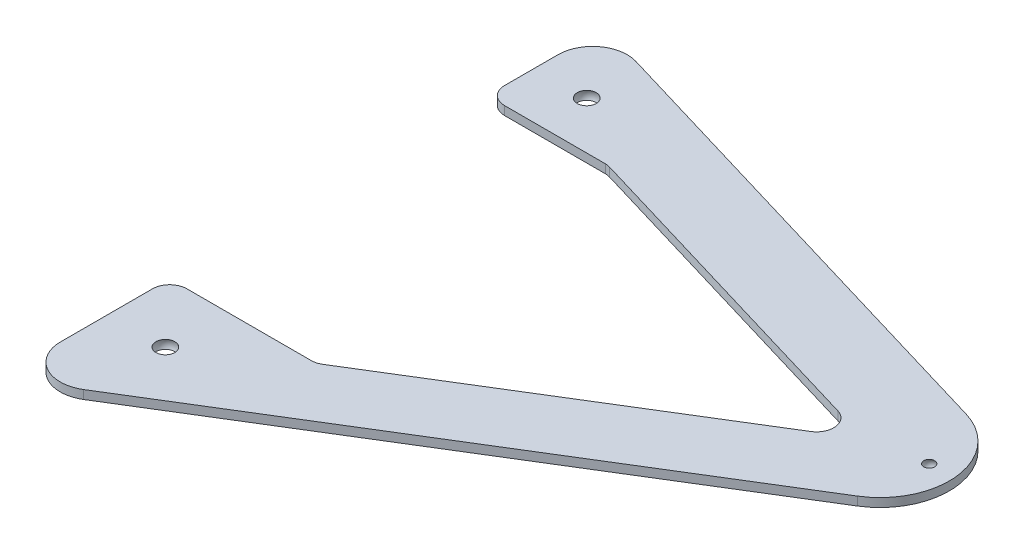
ISO-10303-21;
HEADER;
FILE_DESCRIPTION(('STEP AP214'),'2;1');
FILE_NAME('part.step','',(''),(''),'','','');
FILE_SCHEMA(('AUTOMOTIVE_DESIGN { 1 0 10303 214 1 1 1 1 }'));
ENDSEC;
DATA;
#1=APPLICATION_CONTEXT('core data for automotive mechanical design processes');
#2=APPLICATION_PROTOCOL_DEFINITION('international standard','automotive_design',2000,#1);
#3=PRODUCT_CONTEXT('',#1,'mechanical');
#4=PRODUCT('Part','Part','',(#3));
#5=PRODUCT_RELATED_PRODUCT_CATEGORY('part','',(#4));
#6=PRODUCT_DEFINITION_FORMATION('','',#4);
#7=PRODUCT_DEFINITION_CONTEXT('part definition',#1,'design');
#8=PRODUCT_DEFINITION('design','',#6,#7);
#9=PRODUCT_DEFINITION_SHAPE('','',#8);
#10=(LENGTH_UNIT() NAMED_UNIT(*) SI_UNIT(.MILLI.,.METRE.));
#11=(NAMED_UNIT(*) PLANE_ANGLE_UNIT() SI_UNIT($,.RADIAN.));
#12=(NAMED_UNIT(*) SI_UNIT($,.STERADIAN.) SOLID_ANGLE_UNIT());
#13=UNCERTAINTY_MEASURE_WITH_UNIT(LENGTH_MEASURE(1.E-05),#10,'distance_accuracy_value','');
#14=(GEOMETRIC_REPRESENTATION_CONTEXT(3) GLOBAL_UNCERTAINTY_ASSIGNED_CONTEXT((#13)) GLOBAL_UNIT_ASSIGNED_CONTEXT((#10,
#11,#12)) REPRESENTATION_CONTEXT('',''));
#15=CARTESIAN_POINT('',(0.,0.,0.));
#16=DIRECTION('',(0.,0.,1.));
#17=DIRECTION('',(1.,0.,0.));
#18=AXIS2_PLACEMENT_3D('',#15,#16,#17);
#19=CARTESIAN_POINT('',(0.,5.,0.));
#20=DIRECTION('',(0.,-1.,0.));
#21=DIRECTION('',(0.,0.,-1.));
#22=AXIS2_PLACEMENT_3D('',#19,#20,#21);
#23=PLANE('',#22);
#24=CARTESIAN_POINT('',(311.744565164973,5.,-225.750776405004));
#25=DIRECTION('',(0.,-1.,0.));
#26=DIRECTION('',(0.,0.,-1.));
#27=AXIS2_PLACEMENT_3D('',#24,#25,#26);
#28=CIRCLE('',#27,3.1224989991992);
#29=CARTESIAN_POINT('',(311.744565164973,5.,-228.873275404203));
#30=VERTEX_POINT('',#29);
#31=EDGE_CURVE('E282',#30,#30,#28,.F.);
#32=ORIENTED_EDGE('',*,*,#31,.F.);
#33=EDGE_LOOP('',(#32));
#34=FACE_BOUND('',#33,.T.);
#35=CARTESIAN_POINT('',(32.8765474994996,5.,-63.5675814576575));
#36=DIRECTION('',(0.,-1.,0.));
#37=DIRECTION('',(0.,0.,-1.));
#38=AXIS2_PLACEMENT_3D('',#35,#36,#37);
#39=CIRCLE('',#38,5.45435605731786);
#40=CARTESIAN_POINT('',(32.8765474994996,5.,-69.0219375149754));
#41=VERTEX_POINT('',#40);
#42=EDGE_CURVE('E286',#41,#41,#39,.T.);
#43=ORIENTED_EDGE('',*,*,#42,.T.);
#44=EDGE_LOOP('',(#43));
#45=FACE_BOUND('',#44,.T.);
#46=CARTESIAN_POINT('',(30.,5.,-309.750776405004));
#47=DIRECTION('',(0.,-1.,0.));
#48=DIRECTION('',(0.,0.,-1.));
#49=AXIS2_PLACEMENT_3D('',#46,#47,#48);
#50=CIRCLE('',#49,5.45435605731786);
#51=CARTESIAN_POINT('',(30.,5.,-315.205132462322));
#52=VERTEX_POINT('',#51);
#53=EDGE_CURVE('E278',#52,#52,#50,.T.);
#54=ORIENTED_EDGE('',*,*,#53,.T.);
#55=EDGE_LOOP('',(#54));
#56=FACE_BOUND('',#55,.T.);
#57=DIRECTION('',(-1.,0.,0.));
#58=VECTOR('',#57,1.);
#59=CARTESIAN_POINT('',(84.5466495428396,5.,-98.9467428305968));
#60=LINE('',#59,#58);
#61=CARTESIAN_POINT('',(81.7180530155654,5.,-98.9467428305968));
#62=VERTEX_POINT('',#61);
#63=CARTESIAN_POINT('',(9.99999999999999,5.,-98.9467428305968));
#64=VERTEX_POINT('',#63);
#65=EDGE_CURVE('E264',#62,#64,#60,.T.);
#66=ORIENTED_EDGE('',*,*,#65,.T.);
#67=CARTESIAN_POINT('',(10.,5.,-88.9467428305968));
#68=DIRECTION('',(0.,-1.,0.));
#69=DIRECTION('',(0.,0.,-1.));
#70=AXIS2_PLACEMENT_3D('',#67,#68,#69);
#71=CIRCLE('',#70,10.);
#72=CARTESIAN_POINT('',(0.,5.,-88.9467428305968));
#73=VERTEX_POINT('',#72);
#74=EDGE_CURVE('E225',#64,#73,#71,.F.);
#75=ORIENTED_EDGE('',*,*,#74,.T.);
#76=DIRECTION('',(0.,0.,-1.));
#77=VECTOR('',#76,1.);
#78=CARTESIAN_POINT('',(0.,5.,0.));
#79=LINE('',#78,#77);
#80=CARTESIAN_POINT('',(0.,5.,-35.7770876399967));
#81=VERTEX_POINT('',#80);
#82=EDGE_CURVE('E290',#81,#73,#79,.T.);
#83=ORIENTED_EDGE('',*,*,#82,.F.);
#84=CARTESIAN_POINT('',(20.,5.,-35.7770876399967));
#85=DIRECTION('',(0.,-1.,0.));
#86=DIRECTION('',(0.,0.,-1.));
#87=AXIS2_PLACEMENT_3D('',#84,#85,#86);
#88=CIRCLE('',#87,20.);
#89=CARTESIAN_POINT('',(30.4761904761904,5.,-18.7403792399982));
#90=VERTEX_POINT('',#89);
#91=EDGE_CURVE('E191',#81,#90,#88,.F.);
#92=ORIENTED_EDGE('',*,*,#91,.T.);
#93=DIRECTION('',(-0.85183541999992,0.,0.523809523809524));
#94=VECTOR('',#93,1.);
#95=CARTESIAN_POINT('',(383.325938999964,5.,-235.714285714286));
#96=LINE('',#95,#94);
#97=CARTESIAN_POINT('',(307.135462809488,5.,-188.86333761429));
#98=VERTEX_POINT('',#97);
#99=EDGE_CURVE('E175',#98,#90,#96,.T.);
#100=ORIENTED_EDGE('',*,*,#99,.F.);
#101=CARTESIAN_POINT('',(286.183081857107,5.,-222.936754414287));
#102=DIRECTION('',(0.,-1.,0.));
#103=DIRECTION('',(0.,0.,-1.));
#104=AXIS2_PLACEMENT_3D('',#101,#102,#103);
#105=CIRCLE('',#104,40.);
#106=CARTESIAN_POINT('',(297.611653285678,5.,-261.269348314283));
#107=VERTEX_POINT('',#106);
#108=EDGE_CURVE('E201',#98,#107,#105,.F.);
#109=ORIENTED_EDGE('',*,*,#108,.T.);
#110=DIRECTION('',(0.95831484749991,0.,0.285714285714286));
#111=VECTOR('',#110,1.);
#112=CARTESIAN_POINT('',(0.,5.,-350.));
#113=LINE('',#112,#111);
#114=CARTESIAN_POINT('',(25.7142857142857,5.,-342.333481220001));
#115=VERTEX_POINT('',#114);
#116=EDGE_CURVE('E179',#115,#107,#113,.T.);
#117=ORIENTED_EDGE('',*,*,#116,.F.);
#118=CARTESIAN_POINT('',(20.,5.,-323.167184270002));
#119=DIRECTION('',(0.,-1.,0.));
#120=DIRECTION('',(0.,0.,-1.));
#121=AXIS2_PLACEMENT_3D('',#118,#119,#120);
#122=CIRCLE('',#121,20.);
#123=CARTESIAN_POINT('',(0.,5.,-323.167184270002));
#124=VERTEX_POINT('',#123);
#125=EDGE_CURVE('E188',#115,#124,#122,.F.);
#126=ORIENTED_EDGE('',*,*,#125,.T.);
#127=CARTESIAN_POINT('',(0.,5.,-292.28007616393));
#128=VERTEX_POINT('',#127);
#129=EDGE_CURVE('E160',#128,#124,#79,.T.);
#130=ORIENTED_EDGE('',*,*,#129,.F.);
#131=CARTESIAN_POINT('',(10.,5.,-292.28007616393));
#132=DIRECTION('',(0.,-1.,0.));
#133=DIRECTION('',(0.,0.,-1.));
#134=AXIS2_PLACEMENT_3D('',#131,#132,#133);
#135=CIRCLE('',#134,10.);
#136=CARTESIAN_POINT('',(10.,5.,-282.28007616393));
#137=VERTEX_POINT('',#136);
#138=EDGE_CURVE('E52',#128,#137,#135,.F.);
#139=ORIENTED_EDGE('',*,*,#138,.T.);
#140=DIRECTION('',(1.,0.,0.));
#141=VECTOR('',#140,1.);
#142=CARTESIAN_POINT('',(-35.5023303383956,5.,-282.28007616393));
#143=LINE('',#142,#141);
#144=CARTESIAN_POINT('',(68.180549355338,5.,-282.28007616393));
#145=VERTEX_POINT('',#144);
#146=EDGE_CURVE('E247',#137,#145,#143,.T.);
#147=ORIENTED_EDGE('',*,*,#146,.T.);
#148=CARTESIAN_POINT('',(68.180549355338,5.,-272.28007616393));
#149=DIRECTION('',(0.,-1.,0.));
#150=DIRECTION('',(0.,0.,-1.));
#151=AXIS2_PLACEMENT_3D('',#148,#149,#150);
#152=CIRCLE('',#151,10.);
#153=CARTESIAN_POINT('',(71.0376922124809,5.,-281.863224638929));
#154=VERTEX_POINT('',#153);
#155=EDGE_CURVE('E45',#145,#154,#152,.T.);
#156=ORIENTED_EDGE('',*,*,#155,.T.);
#157=DIRECTION('',(0.95831484749991,0.,0.285714285714286));
#158=VECTOR('',#157,1.);
#159=CARTESIAN_POINT('',(69.6395296928411,5.,-282.28007616393));
#160=LINE('',#159,#158);
#161=CARTESIAN_POINT('',(259.04022471425,5.,-225.811698956787));
#162=VERTEX_POINT('',#161);
#163=EDGE_CURVE('E245',#154,#162,#160,.T.);
#164=ORIENTED_EDGE('',*,*,#163,.T.);
#165=CARTESIAN_POINT('',(256.183081857107,5.,-216.228550481787));
#166=DIRECTION('',(0.,-1.,0.));
#167=DIRECTION('',(0.,0.,-1.));
#168=AXIS2_PLACEMENT_3D('',#165,#166,#167);
#169=CIRCLE('',#168,10.);
#170=CARTESIAN_POINT('',(261.421177095202,5.,-207.710196281788));
#171=VERTEX_POINT('',#170);
#172=EDGE_CURVE('E233',#162,#171,#169,.T.);
#173=ORIENTED_EDGE('',*,*,#172,.T.);
#174=DIRECTION('',(-0.85183541999992,0.,0.523809523809524));
#175=VECTOR('',#174,1.);
#176=CARTESIAN_POINT('',(280.468796142821,5.,-219.422933306787));
#177=LINE('',#176,#175);
#178=CARTESIAN_POINT('',(86.9561482536605,5.,-100.428388630598));
#179=VERTEX_POINT('',#178);
#180=EDGE_CURVE('E253',#171,#179,#177,.T.);
#181=ORIENTED_EDGE('',*,*,#180,.T.);
#182=CARTESIAN_POINT('',(81.7180530155654,5.,-108.946742830597));
#183=DIRECTION('',(0.,-1.,0.));
#184=DIRECTION('',(0.,0.,-1.));
#185=AXIS2_PLACEMENT_3D('',#182,#183,#184);
#186=CIRCLE('',#185,10.);
#187=EDGE_CURVE('E237',#179,#62,#186,.T.);
#188=ORIENTED_EDGE('',*,*,#187,.T.);
#189=EDGE_LOOP('',(#66,#75,#83,#92,#100,#109,#117,#126,#130,#139,#147,#156,#164,#173,#181,#188));
#190=FACE_BOUND('',#189,.T.);
#191=ADVANCED_FACE('F37',(#34,#45,#56,#190),#23,.F.);
#192=CARTESIAN_POINT('',(0.,0.,0.));
#193=DIRECTION('',(0.,-1.,0.));
#194=DIRECTION('',(0.,0.,-1.));
#195=AXIS2_PLACEMENT_3D('',#192,#193,#194);
#196=PLANE('',#195);
#197=CARTESIAN_POINT('',(311.744565164973,0.,-225.750776405004));
#198=DIRECTION('',(0.,-1.,0.));
#199=DIRECTION('',(0.,0.,-1.));
#200=AXIS2_PLACEMENT_3D('',#197,#198,#199);
#201=CIRCLE('',#200,3.1224989991992);
#202=CARTESIAN_POINT('',(311.744565164973,0.,-228.873275404203));
#203=VERTEX_POINT('',#202);
#204=EDGE_CURVE('E281',#203,#203,#201,.F.);
#205=ORIENTED_EDGE('',*,*,#204,.T.);
#206=EDGE_LOOP('',(#205));
#207=FACE_BOUND('',#206,.T.);
#208=CARTESIAN_POINT('',(32.8765474994996,0.,-63.5675814576575));
#209=DIRECTION('',(0.,-1.,0.));
#210=DIRECTION('',(0.,0.,-1.));
#211=AXIS2_PLACEMENT_3D('',#208,#209,#210);
#212=CIRCLE('',#211,5.45435605731786);
#213=CARTESIAN_POINT('',(32.8765474994996,0.,-69.0219375149754));
#214=VERTEX_POINT('',#213);
#215=EDGE_CURVE('E285',#214,#214,#212,.T.);
#216=ORIENTED_EDGE('',*,*,#215,.F.);
#217=EDGE_LOOP('',(#216));
#218=FACE_BOUND('',#217,.T.);
#219=CARTESIAN_POINT('',(30.,0.,-309.750776405004));
#220=DIRECTION('',(0.,-1.,0.));
#221=DIRECTION('',(0.,0.,-1.));
#222=AXIS2_PLACEMENT_3D('',#219,#220,#221);
#223=CIRCLE('',#222,5.45435605731786);
#224=CARTESIAN_POINT('',(30.,0.,-315.205132462322));
#225=VERTEX_POINT('',#224);
#226=EDGE_CURVE('E182',#225,#225,#223,.T.);
#227=ORIENTED_EDGE('',*,*,#226,.F.);
#228=EDGE_LOOP('',(#227));
#229=FACE_BOUND('',#228,.T.);
#230=DIRECTION('',(0.,0.,-1.));
#231=VECTOR('',#230,1.);
#232=CARTESIAN_POINT('',(0.,0.,0.));
#233=LINE('',#232,#231);
#234=CARTESIAN_POINT('',(0.,0.,-35.7770876399967));
#235=VERTEX_POINT('',#234);
#236=CARTESIAN_POINT('',(0.,0.,-88.9467428305968));
#237=VERTEX_POINT('',#236);
#238=EDGE_CURVE('E295',#235,#237,#233,.T.);
#239=ORIENTED_EDGE('',*,*,#238,.T.);
#240=CARTESIAN_POINT('',(10.,0.,-88.9467428305968));
#241=DIRECTION('',(0.,-1.,0.));
#242=DIRECTION('',(0.,0.,-1.));
#243=AXIS2_PLACEMENT_3D('',#240,#241,#242);
#244=CIRCLE('',#243,10.);
#245=CARTESIAN_POINT('',(9.99999999999999,0.,-98.9467428305968));
#246=VERTEX_POINT('',#245);
#247=EDGE_CURVE('E218',#237,#246,#244,.T.);
#248=ORIENTED_EDGE('',*,*,#247,.T.);
#249=DIRECTION('',(-1.,0.,0.));
#250=VECTOR('',#249,1.);
#251=CARTESIAN_POINT('',(84.5466495428396,0.,-98.9467428305968));
#252=LINE('',#251,#250);
#253=CARTESIAN_POINT('',(81.7180530155654,0.,-98.9467428305968));
#254=VERTEX_POINT('',#253);
#255=EDGE_CURVE('E272',#254,#246,#252,.T.);
#256=ORIENTED_EDGE('',*,*,#255,.F.);
#257=CARTESIAN_POINT('',(81.7180530155654,0.,-108.946742830597));
#258=DIRECTION('',(0.,-1.,0.));
#259=DIRECTION('',(0.,0.,-1.));
#260=AXIS2_PLACEMENT_3D('',#257,#258,#259);
#261=CIRCLE('',#260,10.);
#262=CARTESIAN_POINT('',(86.9561482536605,0.,-100.428388630598));
#263=VERTEX_POINT('',#262);
#264=EDGE_CURVE('E239',#254,#263,#261,.F.);
#265=ORIENTED_EDGE('',*,*,#264,.T.);
#266=DIRECTION('',(-0.85183541999992,0.,0.523809523809524));
#267=VECTOR('',#266,1.);
#268=CARTESIAN_POINT('',(280.468796142821,0.,-219.422933306787));
#269=LINE('',#268,#267);
#270=CARTESIAN_POINT('',(261.421177095202,0.,-207.710196281788));
#271=VERTEX_POINT('',#270);
#272=EDGE_CURVE('E266',#271,#263,#269,.T.);
#273=ORIENTED_EDGE('',*,*,#272,.F.);
#274=CARTESIAN_POINT('',(256.183081857107,0.,-216.228550481787));
#275=DIRECTION('',(0.,-1.,0.));
#276=DIRECTION('',(0.,0.,-1.));
#277=AXIS2_PLACEMENT_3D('',#274,#275,#276);
#278=CIRCLE('',#277,10.);
#279=CARTESIAN_POINT('',(259.04022471425,0.,-225.811698956787));
#280=VERTEX_POINT('',#279);
#281=EDGE_CURVE('E235',#271,#280,#278,.F.);
#282=ORIENTED_EDGE('',*,*,#281,.T.);
#283=DIRECTION('',(0.95831484749991,0.,0.285714285714286));
#284=VECTOR('',#283,1.);
#285=CARTESIAN_POINT('',(69.6395296928411,0.,-282.28007616393));
#286=LINE('',#285,#284);
#287=CARTESIAN_POINT('',(71.0376922124809,0.,-281.863224638929));
#288=VERTEX_POINT('',#287);
#289=EDGE_CURVE('E261',#288,#280,#286,.T.);
#290=ORIENTED_EDGE('',*,*,#289,.F.);
#291=CARTESIAN_POINT('',(68.180549355338,0.,-272.28007616393));
#292=DIRECTION('',(0.,-1.,0.));
#293=DIRECTION('',(0.,0.,-1.));
#294=AXIS2_PLACEMENT_3D('',#291,#292,#293);
#295=CIRCLE('',#294,10.);
#296=CARTESIAN_POINT('',(68.180549355338,0.,-282.28007616393));
#297=VERTEX_POINT('',#296);
#298=EDGE_CURVE('E11',#288,#297,#295,.F.);
#299=ORIENTED_EDGE('',*,*,#298,.T.);
#300=DIRECTION('',(1.,0.,0.));
#301=VECTOR('',#300,1.);
#302=CARTESIAN_POINT('',(-35.5023303383956,0.,-282.28007616393));
#303=LINE('',#302,#301);
#304=CARTESIAN_POINT('',(10.,0.,-282.28007616393));
#305=VERTEX_POINT('',#304);
#306=EDGE_CURVE('E259',#305,#297,#303,.T.);
#307=ORIENTED_EDGE('',*,*,#306,.F.);
#308=CARTESIAN_POINT('',(10.,0.,-292.28007616393));
#309=DIRECTION('',(0.,-1.,0.));
#310=DIRECTION('',(0.,0.,-1.));
#311=AXIS2_PLACEMENT_3D('',#308,#309,#310);
#312=CIRCLE('',#311,10.);
#313=CARTESIAN_POINT('',(0.,0.,-292.28007616393));
#314=VERTEX_POINT('',#313);
#315=EDGE_CURVE('E216',#305,#314,#312,.T.);
#316=ORIENTED_EDGE('',*,*,#315,.T.);
#317=CARTESIAN_POINT('',(0.,0.,-323.167184270002));
#318=VERTEX_POINT('',#317);
#319=EDGE_CURVE('E289',#314,#318,#233,.T.);
#320=ORIENTED_EDGE('',*,*,#319,.T.);
#321=CARTESIAN_POINT('',(20.,0.,-323.167184270002));
#322=DIRECTION('',(0.,-1.,0.));
#323=DIRECTION('',(0.,0.,-1.));
#324=AXIS2_PLACEMENT_3D('',#321,#322,#323);
#325=CIRCLE('',#324,20.);
#326=CARTESIAN_POINT('',(25.7142857142857,0.,-342.333481220001));
#327=VERTEX_POINT('',#326);
#328=EDGE_CURVE('E171',#318,#327,#325,.T.);
#329=ORIENTED_EDGE('',*,*,#328,.T.);
#330=DIRECTION('',(0.95831484749991,0.,0.285714285714286));
#331=VECTOR('',#330,1.);
#332=CARTESIAN_POINT('',(0.,0.,-350.));
#333=LINE('',#332,#331);
#334=CARTESIAN_POINT('',(297.611653285678,0.,-261.269348314283));
#335=VERTEX_POINT('',#334);
#336=EDGE_CURVE('E161',#327,#335,#333,.T.);
#337=ORIENTED_EDGE('',*,*,#336,.T.);
#338=CARTESIAN_POINT('',(286.183081857107,0.,-222.936754414287));
#339=DIRECTION('',(0.,-1.,0.));
#340=DIRECTION('',(0.,0.,-1.));
#341=AXIS2_PLACEMENT_3D('',#338,#339,#340);
#342=CIRCLE('',#341,40.);
#343=CARTESIAN_POINT('',(307.135462809488,0.,-188.86333761429));
#344=VERTEX_POINT('',#343);
#345=EDGE_CURVE('E156',#335,#344,#342,.T.);
#346=ORIENTED_EDGE('',*,*,#345,.T.);
#347=DIRECTION('',(-0.85183541999992,0.,0.523809523809524));
#348=VECTOR('',#347,1.);
#349=CARTESIAN_POINT('',(383.325938999964,0.,-235.714285714286));
#350=LINE('',#349,#348);
#351=CARTESIAN_POINT('',(30.4761904761904,0.,-18.7403792399982));
#352=VERTEX_POINT('',#351);
#353=EDGE_CURVE('E149',#344,#352,#350,.T.);
#354=ORIENTED_EDGE('',*,*,#353,.T.);
#355=CARTESIAN_POINT('',(20.,0.,-35.7770876399967));
#356=DIRECTION('',(0.,-1.,0.));
#357=DIRECTION('',(0.,0.,-1.));
#358=AXIS2_PLACEMENT_3D('',#355,#356,#357);
#359=CIRCLE('',#358,20.);
#360=EDGE_CURVE('E153',#352,#235,#359,.T.);
#361=ORIENTED_EDGE('',*,*,#360,.T.);
#362=EDGE_LOOP('',(#239,#248,#256,#265,#273,#282,#290,#299,#307,#316,#320,#329,#337,#346,#354,#361));
#363=FACE_BOUND('',#362,.T.);
#364=ADVANCED_FACE('F152',(#207,#218,#229,#363),#196,.T.);
#365=CARTESIAN_POINT('',(0.,5.,0.));
#366=DIRECTION('',(-1.,0.,0.));
#367=DIRECTION('',(0.,0.,1.));
#368=AXIS2_PLACEMENT_3D('',#365,#366,#367);
#369=PLANE('',#368);
#370=ORIENTED_EDGE('',*,*,#319,.F.);
#371=DIRECTION('',(0.,1.,0.));
#372=VECTOR('',#371,1.);
#373=CARTESIAN_POINT('',(0.,5.,-292.28007616393));
#374=LINE('',#373,#372);
#375=EDGE_CURVE('E231',#314,#128,#374,.T.);
#376=ORIENTED_EDGE('',*,*,#375,.T.);
#377=ORIENTED_EDGE('',*,*,#129,.T.);
#378=DIRECTION('',(0.,-1.,0.));
#379=VECTOR('',#378,1.);
#380=CARTESIAN_POINT('',(0.,5.,-323.167184270002));
#381=LINE('',#380,#379);
#382=EDGE_CURVE('E170',#124,#318,#381,.T.);
#383=ORIENTED_EDGE('',*,*,#382,.T.);
#384=EDGE_LOOP('',(#370,#376,#377,#383));
#385=FACE_BOUND('',#384,.T.);
#386=ADVANCED_FACE('F337',(#385),#369,.T.);
#387=ORIENTED_EDGE('',*,*,#82,.T.);
#388=DIRECTION('',(0.,-1.,0.));
#389=VECTOR('',#388,1.);
#390=CARTESIAN_POINT('',(0.,5.,-88.9467428305968));
#391=LINE('',#390,#389);
#392=EDGE_CURVE('E213',#73,#237,#391,.T.);
#393=ORIENTED_EDGE('',*,*,#392,.T.);
#394=ORIENTED_EDGE('',*,*,#238,.F.);
#395=DIRECTION('',(0.,-1.,0.));
#396=VECTOR('',#395,1.);
#397=CARTESIAN_POINT('',(0.,5.,-35.7770876399967));
#398=LINE('',#397,#396);
#399=EDGE_CURVE('E169',#235,#81,#398,.F.);
#400=ORIENTED_EDGE('',*,*,#399,.T.);
#401=EDGE_LOOP('',(#387,#393,#394,#400));
#402=FACE_BOUND('',#401,.T.);
#403=ADVANCED_FACE('F340',(#402),#369,.T.);
#404=CARTESIAN_POINT('',(383.325938999964,5.,-235.714285714286));
#405=DIRECTION('',(0.523809523809524,0.,0.85183541999992));
#406=DIRECTION('',(0.85183541999992,0.,-0.523809523809524));
#407=AXIS2_PLACEMENT_3D('',#404,#405,#406);
#408=PLANE('',#407);
#409=ORIENTED_EDGE('',*,*,#353,.F.);
#410=DIRECTION('',(0.,-1.,0.));
#411=VECTOR('',#410,1.);
#412=CARTESIAN_POINT('',(307.135462809488,5.,-188.86333761429));
#413=LINE('',#412,#411);
#414=EDGE_CURVE('E199',#344,#98,#413,.F.);
#415=ORIENTED_EDGE('',*,*,#414,.T.);
#416=ORIENTED_EDGE('',*,*,#99,.T.);
#417=DIRECTION('',(0.,-1.,0.));
#418=VECTOR('',#417,1.);
#419=CARTESIAN_POINT('',(30.4761904761904,5.,-18.7403792399983));
#420=LINE('',#419,#418);
#421=EDGE_CURVE('E168',#90,#352,#420,.T.);
#422=ORIENTED_EDGE('',*,*,#421,.T.);
#423=EDGE_LOOP('',(#409,#415,#416,#422));
#424=FACE_BOUND('',#423,.T.);
#425=ADVANCED_FACE('F173',(#424),#408,.T.);
#426=CARTESIAN_POINT('',(0.,5.,-350.));
#427=DIRECTION('',(0.285714285714286,0.,-0.95831484749991));
#428=DIRECTION('',(-0.95831484749991,0.,-0.285714285714286));
#429=AXIS2_PLACEMENT_3D('',#426,#427,#428);
#430=PLANE('',#429);
#431=ORIENTED_EDGE('',*,*,#116,.T.);
#432=DIRECTION('',(0.,-1.,0.));
#433=VECTOR('',#432,1.);
#434=CARTESIAN_POINT('',(297.611653285678,5.,-261.269348314283));
#435=LINE('',#434,#433);
#436=EDGE_CURVE('E195',#107,#335,#435,.T.);
#437=ORIENTED_EDGE('',*,*,#436,.T.);
#438=ORIENTED_EDGE('',*,*,#336,.F.);
#439=DIRECTION('',(0.,-1.,0.));
#440=VECTOR('',#439,1.);
#441=CARTESIAN_POINT('',(25.7142857142857,5.,-342.333481220001));
#442=LINE('',#441,#440);
#443=EDGE_CURVE('E193',#327,#115,#442,.F.);
#444=ORIENTED_EDGE('',*,*,#443,.T.);
#445=EDGE_LOOP('',(#431,#437,#438,#444));
#446=FACE_BOUND('',#445,.T.);
#447=ADVANCED_FACE('F332',(#446),#430,.T.);
#448=CARTESIAN_POINT('',(32.8765474994996,2.5,-63.5675814576575));
#449=DIRECTION('',(0.36777007299788,0.,-0.929916756170752));
#450=DIRECTION('',(0.929916756170752,0.,0.36777007299788));
#451=AXIS2_PLACEMENT_3D('',#448,#449,#450);
#452=SPHERICAL_SURFACE('',#451,6.);
#453=CARTESIAN_POINT('',(32.8765474994996,2.5,-63.5675814576575));
#454=DIRECTION('',(0.,-1.,0.));
#455=DIRECTION('',(0.,0.,-1.));
#456=AXIS2_PLACEMENT_3D('',#453,#454,#455);
#457=SPHERICAL_SURFACE('',#456,6.);
#458=ORIENTED_EDGE('',*,*,#215,.T.);
#459=EDGE_LOOP('',(#458));
#460=FACE_BOUND('',#459,.T.);
#461=ORIENTED_EDGE('',*,*,#42,.F.);
#462=EDGE_LOOP('',(#461));
#463=FACE_BOUND('',#462,.T.);
#464=ADVANCED_FACE('F308',(#460,#463),#457,.F.);
#465=CARTESIAN_POINT('',(311.744565164973,2.5,-225.750776405004));
#466=DIRECTION('',(0.,0.,-1.));
#467=DIRECTION('',(1.,0.,0.));
#468=AXIS2_PLACEMENT_3D('',#465,#466,#467);
#469=SPHERICAL_SURFACE('',#468,4.);
#470=CARTESIAN_POINT('',(311.744565164973,2.5,-225.750776405004));
#471=DIRECTION('',(0.,-1.,0.));
#472=DIRECTION('',(0.,0.,-1.));
#473=AXIS2_PLACEMENT_3D('',#470,#471,#472);
#474=SPHERICAL_SURFACE('',#473,4.);
#475=ORIENTED_EDGE('',*,*,#204,.F.);
#476=EDGE_LOOP('',(#475));
#477=FACE_BOUND('',#476,.T.);
#478=ORIENTED_EDGE('',*,*,#31,.T.);
#479=EDGE_LOOP('',(#478));
#480=FACE_BOUND('',#479,.T.);
#481=ADVANCED_FACE('F304',(#477,#480),#474,.F.);
#482=CARTESIAN_POINT('',(30.,2.5,-309.750776405004));
#483=DIRECTION('',(0.,0.,-1.));
#484=DIRECTION('',(1.,0.,0.));
#485=AXIS2_PLACEMENT_3D('',#482,#483,#484);
#486=SPHERICAL_SURFACE('',#485,6.00000000000001);
#487=CARTESIAN_POINT('',(30.,2.5,-309.750776405004));
#488=DIRECTION('',(0.,-1.,0.));
#489=DIRECTION('',(0.,0.,-1.));
#490=AXIS2_PLACEMENT_3D('',#487,#488,#489);
#491=SPHERICAL_SURFACE('',#490,6.00000000000001);
#492=ORIENTED_EDGE('',*,*,#226,.T.);
#493=EDGE_LOOP('',(#492));
#494=FACE_BOUND('',#493,.T.);
#495=ORIENTED_EDGE('',*,*,#53,.F.);
#496=EDGE_LOOP('',(#495));
#497=FACE_BOUND('',#496,.T.);
#498=ADVANCED_FACE('F307',(#494,#497),#491,.F.);
#499=CARTESIAN_POINT('',(20.,5.,-35.7770876399967));
#500=DIRECTION('',(0.,-1.,0.));
#501=DIRECTION('',(0.,0.,-1.));
#502=AXIS2_PLACEMENT_3D('',#499,#500,#501);
#503=CYLINDRICAL_SURFACE('',#502,20.);
#504=ORIENTED_EDGE('',*,*,#91,.F.);
#505=ORIENTED_EDGE('',*,*,#399,.F.);
#506=ORIENTED_EDGE('',*,*,#360,.F.);
#507=ORIENTED_EDGE('',*,*,#421,.F.);
#508=EDGE_LOOP('',(#504,#505,#506,#507));
#509=FACE_BOUND('',#508,.T.);
#510=ADVANCED_FACE('F167',(#509),#503,.T.);
#511=CARTESIAN_POINT('',(20.,5.,-323.167184270002));
#512=DIRECTION('',(0.,-1.,0.));
#513=DIRECTION('',(0.,0.,-1.));
#514=AXIS2_PLACEMENT_3D('',#511,#512,#513);
#515=CYLINDRICAL_SURFACE('',#514,20.);
#516=ORIENTED_EDGE('',*,*,#125,.F.);
#517=ORIENTED_EDGE('',*,*,#443,.F.);
#518=ORIENTED_EDGE('',*,*,#328,.F.);
#519=ORIENTED_EDGE('',*,*,#382,.F.);
#520=EDGE_LOOP('',(#516,#517,#518,#519));
#521=FACE_BOUND('',#520,.T.);
#522=ADVANCED_FACE('F325',(#521),#515,.T.);
#523=CARTESIAN_POINT('',(286.183081857107,5.,-222.936754414287));
#524=DIRECTION('',(0.,-1.,0.));
#525=DIRECTION('',(0.,0.,-1.));
#526=AXIS2_PLACEMENT_3D('',#523,#524,#525);
#527=CYLINDRICAL_SURFACE('',#526,40.);
#528=ORIENTED_EDGE('',*,*,#108,.F.);
#529=ORIENTED_EDGE('',*,*,#414,.F.);
#530=ORIENTED_EDGE('',*,*,#345,.F.);
#531=ORIENTED_EDGE('',*,*,#436,.F.);
#532=EDGE_LOOP('',(#528,#529,#530,#531));
#533=FACE_BOUND('',#532,.T.);
#534=ADVANCED_FACE('F349',(#533),#527,.T.);
#535=CARTESIAN_POINT('',(-35.5023303383956,0.,-282.28007616393));
#536=DIRECTION('',(0.,0.,1.));
#537=DIRECTION('',(1.,0.,0.));
#538=AXIS2_PLACEMENT_3D('',#535,#536,#537);
#539=PLANE('',#538);
#540=ORIENTED_EDGE('',*,*,#306,.T.);
#541=DIRECTION('',(0.,1.,0.));
#542=VECTOR('',#541,1.);
#543=CARTESIAN_POINT('',(68.180549355338,5.,-282.28007616393));
#544=LINE('',#543,#542);
#545=EDGE_CURVE('E229',#297,#145,#544,.T.);
#546=ORIENTED_EDGE('',*,*,#545,.T.);
#547=ORIENTED_EDGE('',*,*,#146,.F.);
#548=DIRECTION('',(0.,1.,0.));
#549=VECTOR('',#548,1.);
#550=CARTESIAN_POINT('',(10.,0.,-282.28007616393));
#551=LINE('',#550,#549);
#552=EDGE_CURVE('E227',#137,#305,#551,.F.);
#553=ORIENTED_EDGE('',*,*,#552,.T.);
#554=EDGE_LOOP('',(#540,#546,#547,#553));
#555=FACE_BOUND('',#554,.T.);
#556=ADVANCED_FACE('F263',(#555),#539,.T.);
#557=CARTESIAN_POINT('',(69.6395296928411,0.,-282.28007616393));
#558=DIRECTION('',(-0.285714285714286,0.,0.95831484749991));
#559=DIRECTION('',(0.95831484749991,0.,0.285714285714286));
#560=AXIS2_PLACEMENT_3D('',#557,#558,#559);
#561=PLANE('',#560);
#562=ORIENTED_EDGE('',*,*,#289,.T.);
#563=DIRECTION('',(0.,1.,0.));
#564=VECTOR('',#563,1.);
#565=CARTESIAN_POINT('',(259.04022471425,5.,-225.811698956787));
#566=LINE('',#565,#564);
#567=EDGE_CURVE('E205',#280,#162,#566,.T.);
#568=ORIENTED_EDGE('',*,*,#567,.T.);
#569=ORIENTED_EDGE('',*,*,#163,.F.);
#570=DIRECTION('',(0.,1.,0.));
#571=VECTOR('',#570,1.);
#572=CARTESIAN_POINT('',(71.0376922124809,0.,-281.863224638929));
#573=LINE('',#572,#571);
#574=EDGE_CURVE('E203',#154,#288,#573,.F.);
#575=ORIENTED_EDGE('',*,*,#574,.T.);
#576=EDGE_LOOP('',(#562,#568,#569,#575));
#577=FACE_BOUND('',#576,.T.);
#578=ADVANCED_FACE('F250',(#577),#561,.T.);
#579=CARTESIAN_POINT('',(280.468796142821,0.,-219.422933306787));
#580=DIRECTION('',(-0.523809523809524,0.,-0.85183541999992));
#581=DIRECTION('',(-0.85183541999992,0.,0.523809523809524));
#582=AXIS2_PLACEMENT_3D('',#579,#580,#581);
#583=PLANE('',#582);
#584=ORIENTED_EDGE('',*,*,#180,.F.);
#585=DIRECTION('',(0.,1.,0.));
#586=VECTOR('',#585,1.);
#587=CARTESIAN_POINT('',(261.421177095202,0.,-207.710196281788));
#588=LINE('',#587,#586);
#589=EDGE_CURVE('E211',#171,#271,#588,.F.);
#590=ORIENTED_EDGE('',*,*,#589,.T.);
#591=ORIENTED_EDGE('',*,*,#272,.T.);
#592=DIRECTION('',(0.,1.,0.));
#593=VECTOR('',#592,1.);
#594=CARTESIAN_POINT('',(86.9561482536606,5.,-100.428388630598));
#595=LINE('',#594,#593);
#596=EDGE_CURVE('E208',#263,#179,#595,.T.);
#597=ORIENTED_EDGE('',*,*,#596,.T.);
#598=EDGE_LOOP('',(#584,#590,#591,#597));
#599=FACE_BOUND('',#598,.T.);
#600=ADVANCED_FACE('F397',(#599),#583,.T.);
#601=CARTESIAN_POINT('',(84.5466495428396,0.,-98.9467428305968));
#602=DIRECTION('',(0.,0.,-1.));
#603=DIRECTION('',(-1.,0.,0.));
#604=AXIS2_PLACEMENT_3D('',#601,#602,#603);
#605=PLANE('',#604);
#606=ORIENTED_EDGE('',*,*,#255,.T.);
#607=DIRECTION('',(0.,-1.,0.));
#608=VECTOR('',#607,1.);
#609=CARTESIAN_POINT('',(9.99999999999999,0.,-98.9467428305968));
#610=LINE('',#609,#608);
#611=EDGE_CURVE('E222',#246,#64,#610,.F.);
#612=ORIENTED_EDGE('',*,*,#611,.T.);
#613=ORIENTED_EDGE('',*,*,#65,.F.);
#614=DIRECTION('',(0.,1.,0.));
#615=VECTOR('',#614,1.);
#616=CARTESIAN_POINT('',(81.7180530155654,0.,-98.9467428305968));
#617=LINE('',#616,#615);
#618=EDGE_CURVE('E220',#62,#254,#617,.F.);
#619=ORIENTED_EDGE('',*,*,#618,.T.);
#620=EDGE_LOOP('',(#606,#612,#613,#619));
#621=FACE_BOUND('',#620,.T.);
#622=ADVANCED_FACE('F358',(#621),#605,.T.);
#623=CARTESIAN_POINT('',(256.183081857107,0.,-216.228550481787));
#624=DIRECTION('',(0.,-1.,0.));
#625=DIRECTION('',(0.,0.,-1.));
#626=AXIS2_PLACEMENT_3D('',#623,#624,#625);
#627=CYLINDRICAL_SURFACE('',#626,10.);
#628=ORIENTED_EDGE('',*,*,#281,.F.);
#629=ORIENTED_EDGE('',*,*,#589,.F.);
#630=ORIENTED_EDGE('',*,*,#172,.F.);
#631=ORIENTED_EDGE('',*,*,#567,.F.);
#632=EDGE_LOOP('',(#628,#629,#630,#631));
#633=FACE_BOUND('',#632,.T.);
#634=ADVANCED_FACE('F354',(#633),#627,.F.);
#635=CARTESIAN_POINT('',(10.,5.,-88.9467428305968));
#636=DIRECTION('',(0.,-1.,0.));
#637=DIRECTION('',(0.,0.,-1.));
#638=AXIS2_PLACEMENT_3D('',#635,#636,#637);
#639=CYLINDRICAL_SURFACE('',#638,10.);
#640=ORIENTED_EDGE('',*,*,#74,.F.);
#641=ORIENTED_EDGE('',*,*,#611,.F.);
#642=ORIENTED_EDGE('',*,*,#247,.F.);
#643=ORIENTED_EDGE('',*,*,#392,.F.);
#644=EDGE_LOOP('',(#640,#641,#642,#643));
#645=FACE_BOUND('',#644,.T.);
#646=ADVANCED_FACE('F357',(#645),#639,.T.);
#647=CARTESIAN_POINT('',(81.7180530155654,0.,-108.946742830597));
#648=DIRECTION('',(0.,-1.,0.));
#649=DIRECTION('',(0.,0.,-1.));
#650=AXIS2_PLACEMENT_3D('',#647,#648,#649);
#651=CYLINDRICAL_SURFACE('',#650,10.);
#652=ORIENTED_EDGE('',*,*,#264,.F.);
#653=ORIENTED_EDGE('',*,*,#618,.F.);
#654=ORIENTED_EDGE('',*,*,#187,.F.);
#655=ORIENTED_EDGE('',*,*,#596,.F.);
#656=EDGE_LOOP('',(#652,#653,#654,#655));
#657=FACE_BOUND('',#656,.T.);
#658=ADVANCED_FACE('F362',(#657),#651,.F.);
#659=CARTESIAN_POINT('',(68.180549355338,0.,-272.28007616393));
#660=DIRECTION('',(0.,-1.,0.));
#661=DIRECTION('',(0.,0.,-1.));
#662=AXIS2_PLACEMENT_3D('',#659,#660,#661);
#663=CYLINDRICAL_SURFACE('',#662,10.);
#664=ORIENTED_EDGE('',*,*,#298,.F.);
#665=ORIENTED_EDGE('',*,*,#574,.F.);
#666=ORIENTED_EDGE('',*,*,#155,.F.);
#667=ORIENTED_EDGE('',*,*,#545,.F.);
#668=EDGE_LOOP('',(#664,#665,#666,#667));
#669=FACE_BOUND('',#668,.T.);
#670=ADVANCED_FACE('F256',(#669),#663,.F.);
#671=CARTESIAN_POINT('',(10.,5.,-292.28007616393));
#672=DIRECTION('',(0.,1.,0.));
#673=DIRECTION('',(0.,0.,1.));
#674=AXIS2_PLACEMENT_3D('',#671,#672,#673);
#675=CYLINDRICAL_SURFACE('',#674,10.);
#676=ORIENTED_EDGE('',*,*,#315,.F.);
#677=ORIENTED_EDGE('',*,*,#552,.F.);
#678=ORIENTED_EDGE('',*,*,#138,.F.);
#679=ORIENTED_EDGE('',*,*,#375,.F.);
#680=EDGE_LOOP('',(#676,#677,#678,#679));
#681=FACE_BOUND('',#680,.T.);
#682=ADVANCED_FACE('F39',(#681),#675,.T.);
#683=CLOSED_SHELL('',(#191,#364,#386,#403,#425,#447,#464,#481,#498,#510,#522,#534,#556,#578,
#600,#622,#634,#646,#658,#670,#682));
#684=MANIFOLD_SOLID_BREP('B2',#683);
#685=ADVANCED_BREP_SHAPE_REPRESENTATION('',(#18,#684),#14);
#686=SHAPE_DEFINITION_REPRESENTATION(#9,#685);
ENDSEC;
END-ISO-10303-21;
